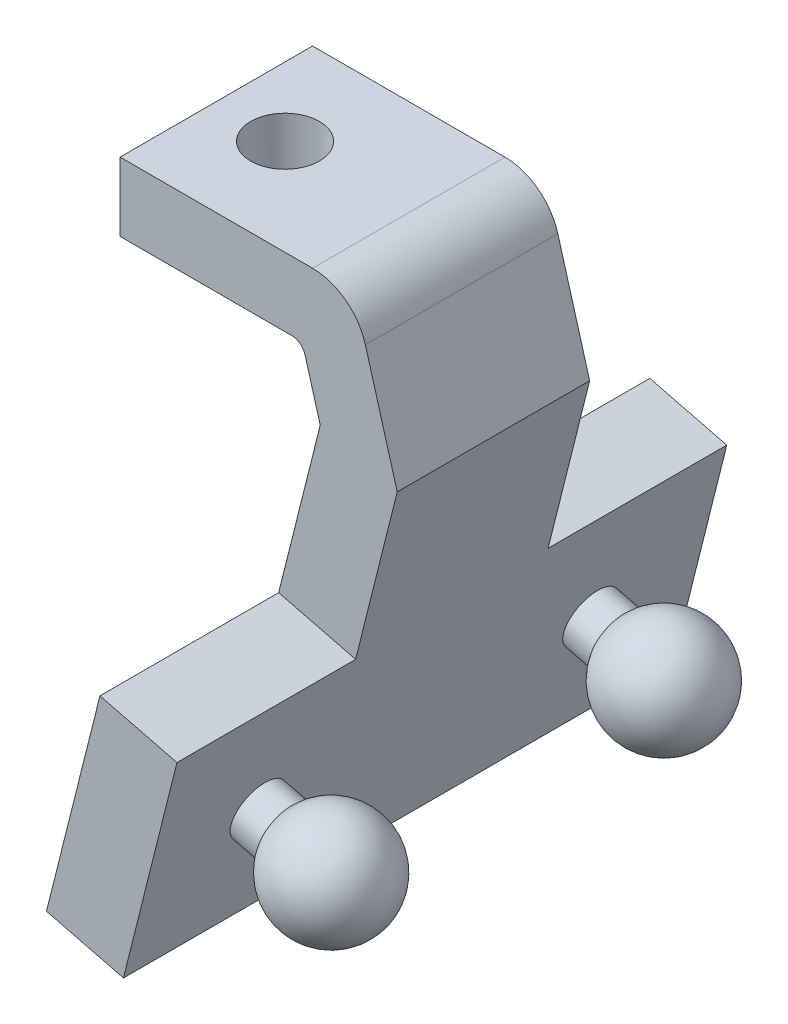
ISO-10303-21;
HEADER;
FILE_DESCRIPTION(('STEP AP214'),'2;1');
FILE_NAME('part.step','',(''),(''),'','','');
FILE_SCHEMA(('AUTOMOTIVE_DESIGN { 1 0 10303 214 1 1 1 1 }'));
ENDSEC;
DATA;
#1=APPLICATION_CONTEXT('core data for automotive mechanical design processes');
#2=APPLICATION_PROTOCOL_DEFINITION('international standard','automotive_design',2000,#1);
#3=PRODUCT_CONTEXT('',#1,'mechanical');
#4=PRODUCT('Part','Part','',(#3));
#5=PRODUCT_RELATED_PRODUCT_CATEGORY('part','',(#4));
#6=PRODUCT_DEFINITION_FORMATION('','',#4);
#7=PRODUCT_DEFINITION_CONTEXT('part definition',#1,'design');
#8=PRODUCT_DEFINITION('design','',#6,#7);
#9=PRODUCT_DEFINITION_SHAPE('','',#8);
#10=(LENGTH_UNIT() NAMED_UNIT(*) SI_UNIT(.MILLI.,.METRE.));
#11=(NAMED_UNIT(*) PLANE_ANGLE_UNIT() SI_UNIT($,.RADIAN.));
#12=(NAMED_UNIT(*) SI_UNIT($,.STERADIAN.) SOLID_ANGLE_UNIT());
#13=UNCERTAINTY_MEASURE_WITH_UNIT(LENGTH_MEASURE(1.E-05),#10,'distance_accuracy_value','');
#14=(GEOMETRIC_REPRESENTATION_CONTEXT(3) GLOBAL_UNCERTAINTY_ASSIGNED_CONTEXT((#13)) GLOBAL_UNIT_ASSIGNED_CONTEXT((#10,
#11,#12)) REPRESENTATION_CONTEXT('',''));
#15=CARTESIAN_POINT('',(0.,0.,0.));
#16=DIRECTION('',(0.,0.,1.));
#17=DIRECTION('',(1.,0.,0.));
#18=AXIS2_PLACEMENT_3D('',#15,#16,#17);
#19=CARTESIAN_POINT('',(0.,0.,3.5));
#20=DIRECTION('',(1.,0.,0.));
#21=DIRECTION('',(0.,0.,-1.));
#22=AXIS2_PLACEMENT_3D('',#19,#20,#21);
#23=PLANE('',#22);
#24=DIRECTION('',(0.,-1.,0.));
#25=VECTOR('',#24,1.);
#26=CARTESIAN_POINT('',(0.,0.,-3.5));
#27=LINE('',#26,#25);
#28=CARTESIAN_POINT('',(0.,2.5,-3.5));
#29=VERTEX_POINT('',#28);
#30=CARTESIAN_POINT('',(0.,0.,-3.5));
#31=VERTEX_POINT('',#30);
#32=EDGE_CURVE('E212',#29,#31,#27,.T.);
#33=ORIENTED_EDGE('',*,*,#32,.T.);
#34=DIRECTION('',(0.,0.,-1.));
#35=VECTOR('',#34,1.);
#36=CARTESIAN_POINT('',(0.,0.,3.5));
#37=LINE('',#36,#35);
#38=CARTESIAN_POINT('',(0.,0.,3.5));
#39=VERTEX_POINT('',#38);
#40=EDGE_CURVE('E252',#39,#31,#37,.T.);
#41=ORIENTED_EDGE('',*,*,#40,.F.);
#42=DIRECTION('',(0.,-1.,0.));
#43=VECTOR('',#42,1.);
#44=CARTESIAN_POINT('',(0.,0.,3.5));
#45=LINE('',#44,#43);
#46=CARTESIAN_POINT('',(0.,2.5,3.5));
#47=VERTEX_POINT('',#46);
#48=EDGE_CURVE('E192',#47,#39,#45,.T.);
#49=ORIENTED_EDGE('',*,*,#48,.F.);
#50=DIRECTION('',(0.,0.,-1.));
#51=VECTOR('',#50,1.);
#52=CARTESIAN_POINT('',(0.,2.5,3.5));
#53=LINE('',#52,#51);
#54=EDGE_CURVE('E211',#47,#29,#53,.T.);
#55=ORIENTED_EDGE('',*,*,#54,.T.);
#56=EDGE_LOOP('',(#33,#41,#49,#55));
#57=FACE_BOUND('',#56,.T.);
#58=ADVANCED_FACE('F41',(#57),#23,.F.);
#59=CARTESIAN_POINT('',(0.,0.,3.5));
#60=DIRECTION('',(0.,1.,0.));
#61=DIRECTION('',(0.,0.,1.));
#62=AXIS2_PLACEMENT_3D('',#59,#60,#61);
#63=PLANE('',#62);
#64=CARTESIAN_POINT('',(2.5,0.,0.));
#65=DIRECTION('',(0.,-1.,0.));
#66=DIRECTION('',(1.,0.,0.));
#67=AXIS2_PLACEMENT_3D('',#64,#65,#66);
#68=CIRCLE('',#67,1.25);
#69=CARTESIAN_POINT('',(3.75,0.,0.));
#70=VERTEX_POINT('',#69);
#71=EDGE_CURVE('E188',#70,#70,#68,.T.);
#72=ORIENTED_EDGE('',*,*,#71,.F.);
#73=EDGE_LOOP('',(#72));
#74=FACE_BOUND('',#73,.T.);
#75=DIRECTION('',(1.,0.,0.));
#76=VECTOR('',#75,1.);
#77=CARTESIAN_POINT('',(0.,0.,-3.5));
#78=LINE('',#77,#76);
#79=CARTESIAN_POINT('',(6.24543275290352,0.,-3.5));
#80=VERTEX_POINT('',#79);
#81=EDGE_CURVE('E215',#31,#80,#78,.T.);
#82=ORIENTED_EDGE('',*,*,#81,.T.);
#83=DIRECTION('',(0.,0.,-1.));
#84=VECTOR('',#83,1.);
#85=CARTESIAN_POINT('',(6.24543275290352,0.,3.5));
#86=LINE('',#85,#84);
#87=CARTESIAN_POINT('',(6.24543275290352,0.,3.5));
#88=VERTEX_POINT('',#87);
#89=EDGE_CURVE('E249',#88,#80,#86,.T.);
#90=ORIENTED_EDGE('',*,*,#89,.F.);
#91=DIRECTION('',(1.,0.,0.));
#92=VECTOR('',#91,1.);
#93=CARTESIAN_POINT('',(0.,0.,3.5));
#94=LINE('',#93,#92);
#95=EDGE_CURVE('E195',#39,#88,#94,.T.);
#96=ORIENTED_EDGE('',*,*,#95,.F.);
#97=ORIENTED_EDGE('',*,*,#40,.T.);
#98=EDGE_LOOP('',(#82,#90,#96,#97));
#99=FACE_BOUND('',#98,.T.);
#100=ADVANCED_FACE('F295',(#74,#99),#63,.F.);
#101=CARTESIAN_POINT('',(6.24543275290367,-0.5,3.5));
#102=DIRECTION('',(0.,0.,-1.));
#103=DIRECTION('',(-1.,0.,0.));
#104=AXIS2_PLACEMENT_3D('',#101,#102,#103);
#105=CYLINDRICAL_SURFACE('',#104,0.499999999999929);
#106=CARTESIAN_POINT('',(6.24543275290367,-0.5,-3.5));
#107=DIRECTION('',(0.,0.,-1.));
#108=DIRECTION('',(-1.,0.,0.));
#109=AXIS2_PLACEMENT_3D('',#106,#107,#108);
#110=CIRCLE('',#109,0.499999999999929);
#111=CARTESIAN_POINT('',(6.72624123981867,-0.362802336352114,-3.5));
#112=VERTEX_POINT('',#111);
#113=EDGE_CURVE('E217',#80,#112,#110,.T.);
#114=ORIENTED_EDGE('',*,*,#113,.T.);
#115=DIRECTION('',(0.,0.,-1.));
#116=VECTOR('',#115,1.);
#117=CARTESIAN_POINT('',(6.72624123981867,-0.362802336352114,3.5));
#118=LINE('',#117,#116);
#119=CARTESIAN_POINT('',(6.72624123981867,-0.362802336352114,3.5));
#120=VERTEX_POINT('',#119);
#121=EDGE_CURVE('E246',#120,#112,#118,.T.);
#122=ORIENTED_EDGE('',*,*,#121,.F.);
#123=CARTESIAN_POINT('',(6.24543275290367,-0.5,3.5));
#124=DIRECTION('',(0.,0.,-1.));
#125=DIRECTION('',(-1.,0.,0.));
#126=AXIS2_PLACEMENT_3D('',#123,#124,#125);
#127=CIRCLE('',#126,0.499999999999929);
#128=EDGE_CURVE('E198',#88,#120,#127,.T.);
#129=ORIENTED_EDGE('',*,*,#128,.F.);
#130=ORIENTED_EDGE('',*,*,#89,.T.);
#131=EDGE_LOOP('',(#114,#122,#129,#130));
#132=FACE_BOUND('',#131,.T.);
#133=ADVANCED_FACE('F291',(#132),#105,.F.);
#134=CARTESIAN_POINT('',(6.7262412398186,-0.362802336352133,3.5));
#135=DIRECTION('',(0.961616973830157,0.274395327295732,0.));
#136=DIRECTION('',(-0.274395327295732,0.961616973830157,0.));
#137=AXIS2_PLACEMENT_3D('',#134,#135,#136);
#138=PLANE('',#137);
#139=DIRECTION('',(0.274395327295732,-0.961616973830156,0.));
#140=VECTOR('',#139,1.);
#141=CARTESIAN_POINT('',(6.7262412398186,-0.362802336352133,-3.5));
#142=LINE('',#141,#140);
#143=CARTESIAN_POINT('',(7.28017081267278,-2.30404559589561,-3.5));
#144=VERTEX_POINT('',#143);
#145=EDGE_CURVE('E219',#112,#144,#142,.T.);
#146=ORIENTED_EDGE('',*,*,#145,.T.);
#147=DIRECTION('',(0.,0.,-1.));
#148=VECTOR('',#147,1.);
#149=CARTESIAN_POINT('',(7.28017081267278,-2.30404559589561,3.5));
#150=LINE('',#149,#148);
#151=CARTESIAN_POINT('',(7.28017081267278,-2.30404559589561,3.5));
#152=VERTEX_POINT('',#151);
#153=EDGE_CURVE('E244',#152,#144,#150,.T.);
#154=ORIENTED_EDGE('',*,*,#153,.F.);
#155=DIRECTION('',(0.274395327295732,-0.961616973830156,0.));
#156=VECTOR('',#155,1.);
#157=CARTESIAN_POINT('',(6.7262412398186,-0.362802336352133,3.5));
#158=LINE('',#157,#156);
#159=EDGE_CURVE('E200',#120,#152,#158,.T.);
#160=ORIENTED_EDGE('',*,*,#159,.F.);
#161=ORIENTED_EDGE('',*,*,#121,.T.);
#162=EDGE_LOOP('',(#146,#154,#160,#161));
#163=FACE_BOUND('',#162,.T.);
#164=ADVANCED_FACE('F286',(#163),#138,.F.);
#165=CARTESIAN_POINT('',(7.28017081267278,-2.30404559589561,3.5));
#166=DIRECTION('',(0.969982391695104,-0.243175162797203,0.));
#167=DIRECTION('',(0.243175162797203,0.969982391695104,0.));
#168=AXIS2_PLACEMENT_3D('',#165,#166,#167);
#169=PLANE('',#168);
#170=DIRECTION('',(-0.243175162797203,-0.969982391695104,0.));
#171=VECTOR('',#170,1.);
#172=CARTESIAN_POINT('',(7.28017081267278,-2.30404559589561,-3.5));
#173=LINE('',#172,#171);
#174=CARTESIAN_POINT('',(5.76806067353204,-8.33558348981006,-3.5));
#175=VERTEX_POINT('',#174);
#176=EDGE_CURVE('E159',#144,#175,#173,.T.);
#177=ORIENTED_EDGE('',*,*,#176,.T.);
#178=DIRECTION('',(0.,0.,1.));
#179=VECTOR('',#178,1.);
#180=CARTESIAN_POINT('',(5.76806067353204,-8.33558348981006,10.));
#181=LINE('',#180,#179);
#182=CARTESIAN_POINT('',(5.76806067353204,-8.33558348981006,-10.));
#183=VERTEX_POINT('',#182);
#184=EDGE_CURVE('E144',#183,#175,#181,.T.);
#185=ORIENTED_EDGE('',*,*,#184,.F.);
#186=DIRECTION('',(0.243175162797199,0.969982391695105,0.));
#187=VECTOR('',#186,1.);
#188=CARTESIAN_POINT('',(5.76806067353204,-8.33558348981006,-10.));
#189=LINE('',#188,#187);
#190=CARTESIAN_POINT('',(3.82265937115445,-16.0954426233709,-10.));
#191=VERTEX_POINT('',#190);
#192=EDGE_CURVE('E156',#191,#183,#189,.T.);
#193=ORIENTED_EDGE('',*,*,#192,.F.);
#194=DIRECTION('',(0.,0.,-1.));
#195=VECTOR('',#194,1.);
#196=CARTESIAN_POINT('',(3.82265937115443,-16.0954426233709,3.5));
#197=LINE('',#196,#195);
#198=CARTESIAN_POINT('',(3.82265937115445,-16.0954426233709,10.));
#199=VERTEX_POINT('',#198);
#200=EDGE_CURVE('E242',#199,#191,#197,.T.);
#201=ORIENTED_EDGE('',*,*,#200,.F.);
#202=DIRECTION('',(-0.243175162797199,-0.969982391695105,0.));
#203=VECTOR('',#202,1.);
#204=CARTESIAN_POINT('',(5.76806067353204,-8.33558348981006,10.));
#205=LINE('',#204,#203);
#206=CARTESIAN_POINT('',(5.76806067353204,-8.33558348981006,10.));
#207=VERTEX_POINT('',#206);
#208=EDGE_CURVE('E150',#207,#199,#205,.T.);
#209=ORIENTED_EDGE('',*,*,#208,.F.);
#210=CARTESIAN_POINT('',(5.76806067353205,-8.33558348981006,3.5));
#211=VERTEX_POINT('',#210);
#212=EDGE_CURVE('E160',#211,#207,#181,.T.);
#213=ORIENTED_EDGE('',*,*,#212,.F.);
#214=DIRECTION('',(-0.243175162797203,-0.969982391695104,0.));
#215=VECTOR('',#214,1.);
#216=CARTESIAN_POINT('',(7.28017081267278,-2.30404559589561,3.5));
#217=LINE('',#216,#215);
#218=EDGE_CURVE('E55',#152,#211,#217,.T.);
#219=ORIENTED_EDGE('',*,*,#218,.F.);
#220=ORIENTED_EDGE('',*,*,#153,.T.);
#221=EDGE_LOOP('',(#177,#185,#193,#201,#209,#213,#219,#220));
#222=FACE_BOUND('',#221,.T.);
#223=ADVANCED_FACE('F155',(#222),#169,.F.);
#224=CARTESIAN_POINT('',(3.82265937115443,-16.0954426233709,3.5));
#225=DIRECTION('',(0.243175162797201,0.969982391695104,0.));
#226=DIRECTION('',(-0.969982391695104,0.243175162797201,0.));
#227=AXIS2_PLACEMENT_3D('',#224,#225,#226);
#228=PLANE('',#227);
#229=ORIENTED_EDGE('',*,*,#200,.T.);
#230=DIRECTION('',(0.969982391695105,-0.243175162797199,0.));
#231=VECTOR('',#230,1.);
#232=CARTESIAN_POINT('',(3.82265937115445,-16.0954426233709,-10.));
#233=LINE('',#232,#231);
#234=CARTESIAN_POINT('',(6.62275734592642,-16.7974288518769,-10.));
#235=VERTEX_POINT('',#234);
#236=EDGE_CURVE('E165',#191,#235,#233,.T.);
#237=ORIENTED_EDGE('',*,*,#236,.T.);
#238=DIRECTION('',(0.,0.,-1.));
#239=VECTOR('',#238,1.);
#240=CARTESIAN_POINT('',(6.6227573459264,-16.7974288518769,3.5));
#241=LINE('',#240,#239);
#242=CARTESIAN_POINT('',(6.62275734592642,-16.7974288518769,10.));
#243=VERTEX_POINT('',#242);
#244=EDGE_CURVE('E240',#243,#235,#241,.T.);
#245=ORIENTED_EDGE('',*,*,#244,.F.);
#246=DIRECTION('',(0.969982391695105,-0.243175162797199,0.));
#247=VECTOR('',#246,1.);
#248=CARTESIAN_POINT('',(3.82265937115445,-16.0954426233709,10.));
#249=LINE('',#248,#247);
#250=EDGE_CURVE('E182',#199,#243,#249,.T.);
#251=ORIENTED_EDGE('',*,*,#250,.F.);
#252=EDGE_LOOP('',(#229,#237,#245,#251));
#253=FACE_BOUND('',#252,.T.);
#254=ADVANCED_FACE('F282',(#253),#228,.F.);
#255=CARTESIAN_POINT('',(6.6227573459264,-16.7974288518769,3.5));
#256=DIRECTION('',(-0.969982391695105,0.2431751627972,0.));
#257=DIRECTION('',(-0.2431751627972,-0.969982391695105,0.));
#258=AXIS2_PLACEMENT_3D('',#255,#256,#257);
#259=PLANE('',#258);
#260=CARTESIAN_POINT('',(7.57848152332634,-12.9852154139102,-6.05019385851449));
#261=DIRECTION('',(-0.969982391695105,0.243175162797199,0.));
#262=DIRECTION('',(0.243175162797199,0.969982391695105,0.));
#263=AXIS2_PLACEMENT_3D('',#260,#261,#262);
#264=CIRCLE('',#263,1.);
#265=CARTESIAN_POINT('',(7.82165668612354,-12.0152330222151,-6.05019385851449));
#266=VERTEX_POINT('',#265);
#267=EDGE_CURVE('E341',#266,#266,#264,.T.);
#268=ORIENTED_EDGE('',*,*,#267,.T.);
#269=EDGE_LOOP('',(#268));
#270=FACE_BOUND('',#269,.T.);
#271=CARTESIAN_POINT('',(7.57848152332632,-12.9852154139102,6.05019385851449));
#272=DIRECTION('',(-0.969982391695105,0.2431751627972,0.));
#273=DIRECTION('',(-0.2431751627972,-0.969982391695105,0.));
#274=AXIS2_PLACEMENT_3D('',#271,#272,#273);
#275=CIRCLE('',#274,1.);
#276=CARTESIAN_POINT('',(7.33530636052912,-13.9551978056053,6.05019385851449));
#277=VERTEX_POINT('',#276);
#278=EDGE_CURVE('E11',#277,#277,#275,.F.);
#279=ORIENTED_EDGE('',*,*,#278,.F.);
#280=EDGE_LOOP('',(#279));
#281=FACE_BOUND('',#280,.T.);
#282=DIRECTION('',(0.2431751627972,0.969982391695105,0.));
#283=VECTOR('',#282,1.);
#284=CARTESIAN_POINT('',(6.6227573459264,-16.7974288518769,3.5));
#285=LINE('',#284,#283);
#286=CARTESIAN_POINT('',(8.568158648304,-9.03756971831606,3.5));
#287=VERTEX_POINT('',#286);
#288=CARTESIAN_POINT('',(10.0802687874447,-3.00603182440153,3.5));
#289=VERTEX_POINT('',#288);
#290=EDGE_CURVE('E203',#287,#289,#285,.T.);
#291=ORIENTED_EDGE('',*,*,#290,.F.);
#292=DIRECTION('',(0.,0.,1.));
#293=VECTOR('',#292,1.);
#294=CARTESIAN_POINT('',(8.568158648304,-9.03756971831606,10.));
#295=LINE('',#294,#293);
#296=CARTESIAN_POINT('',(8.568158648304,-9.03756971831606,10.));
#297=VERTEX_POINT('',#296);
#298=EDGE_CURVE('E178',#287,#297,#295,.T.);
#299=ORIENTED_EDGE('',*,*,#298,.T.);
#300=DIRECTION('',(-0.243175162797199,-0.969982391695105,0.));
#301=VECTOR('',#300,1.);
#302=CARTESIAN_POINT('',(8.568158648304,-9.03756971831606,10.));
#303=LINE('',#302,#301);
#304=EDGE_CURVE('E166',#297,#243,#303,.T.);
#305=ORIENTED_EDGE('',*,*,#304,.T.);
#306=ORIENTED_EDGE('',*,*,#244,.T.);
#307=DIRECTION('',(0.243175162797199,0.969982391695105,0.));
#308=VECTOR('',#307,1.);
#309=CARTESIAN_POINT('',(8.568158648304,-9.03756971831606,-10.));
#310=LINE('',#309,#308);
#311=CARTESIAN_POINT('',(8.568158648304,-9.03756971831606,-10.));
#312=VERTEX_POINT('',#311);
#313=EDGE_CURVE('E176',#235,#312,#310,.T.);
#314=ORIENTED_EDGE('',*,*,#313,.T.);
#315=CARTESIAN_POINT('',(8.56815864830399,-9.03756971831606,-3.5));
#316=VERTEX_POINT('',#315);
#317=EDGE_CURVE('E63',#312,#316,#295,.T.);
#318=ORIENTED_EDGE('',*,*,#317,.T.);
#319=DIRECTION('',(0.2431751627972,0.969982391695105,0.));
#320=VECTOR('',#319,1.);
#321=CARTESIAN_POINT('',(6.6227573459264,-16.7974288518769,-3.5));
#322=LINE('',#321,#320);
#323=CARTESIAN_POINT('',(10.0802687874447,-3.00603182440153,-3.5));
#324=VERTEX_POINT('',#323);
#325=EDGE_CURVE('E222',#316,#324,#322,.T.);
#326=ORIENTED_EDGE('',*,*,#325,.T.);
#327=DIRECTION('',(0.,0.,-1.));
#328=VECTOR('',#327,1.);
#329=CARTESIAN_POINT('',(10.0802687874447,-3.00603182440153,3.5));
#330=LINE('',#329,#328);
#331=EDGE_CURVE('E237',#289,#324,#330,.T.);
#332=ORIENTED_EDGE('',*,*,#331,.F.);
#333=EDGE_LOOP('',(#291,#299,#305,#306,#314,#318,#326,#332));
#334=FACE_BOUND('',#333,.T.);
#335=ADVANCED_FACE('F263',(#270,#281,#334),#259,.F.);
#336=CARTESIAN_POINT('',(10.0802687874447,-3.00603182440153,3.5));
#337=DIRECTION('',(-0.961616973830156,-0.274395327295733,0.));
#338=DIRECTION('',(0.274395327295733,-0.961616973830156,0.));
#339=AXIS2_PLACEMENT_3D('',#336,#337,#338);
#340=PLANE('',#339);
#341=DIRECTION('',(-0.274395327295733,0.961616973830157,0.));
#342=VECTOR('',#341,1.);
#343=CARTESIAN_POINT('',(10.0802687874447,-3.00603182440153,-3.5));
#344=LINE('',#343,#342);
#345=CARTESIAN_POINT('',(8.92323394766049,1.04879065459145,-3.5));
#346=VERTEX_POINT('',#345);
#347=EDGE_CURVE('E224',#324,#346,#344,.T.);
#348=ORIENTED_EDGE('',*,*,#347,.T.);
#349=DIRECTION('',(0.,0.,-1.));
#350=VECTOR('',#349,1.);
#351=CARTESIAN_POINT('',(8.92323394766049,1.04879065459145,3.5));
#352=LINE('',#351,#350);
#353=CARTESIAN_POINT('',(8.92323394766049,1.04879065459145,3.5));
#354=VERTEX_POINT('',#353);
#355=EDGE_CURVE('E234',#354,#346,#352,.T.);
#356=ORIENTED_EDGE('',*,*,#355,.F.);
#357=DIRECTION('',(-0.274395327295733,0.961616973830157,0.));
#358=VECTOR('',#357,1.);
#359=CARTESIAN_POINT('',(10.0802687874447,-3.00603182440153,3.5));
#360=LINE('',#359,#358);
#361=EDGE_CURVE('E205',#289,#354,#360,.T.);
#362=ORIENTED_EDGE('',*,*,#361,.F.);
#363=ORIENTED_EDGE('',*,*,#331,.T.);
#364=EDGE_LOOP('',(#348,#356,#362,#363));
#365=FACE_BOUND('',#364,.T.);
#366=ADVANCED_FACE('F266',(#365),#340,.F.);
#367=CARTESIAN_POINT('',(7.,0.5,3.5));
#368=DIRECTION('',(0.,0.,-1.));
#369=DIRECTION('',(-1.,0.,0.));
#370=AXIS2_PLACEMENT_3D('',#367,#368,#369);
#371=CYLINDRICAL_SURFACE('',#370,2.00000000000008);
#372=CARTESIAN_POINT('',(7.,0.5,-3.5));
#373=DIRECTION('',(0.,0.,1.));
#374=DIRECTION('',(1.,0.,0.));
#375=AXIS2_PLACEMENT_3D('',#372,#373,#374);
#376=CIRCLE('',#375,2.00000000000008);
#377=CARTESIAN_POINT('',(7.,2.50000000000008,-3.5));
#378=VERTEX_POINT('',#377);
#379=EDGE_CURVE('E226',#346,#378,#376,.T.);
#380=ORIENTED_EDGE('',*,*,#379,.T.);
#381=DIRECTION('',(0.,0.,-1.));
#382=VECTOR('',#381,1.);
#383=CARTESIAN_POINT('',(7.,2.50000000000008,3.5));
#384=LINE('',#383,#382);
#385=CARTESIAN_POINT('',(7.,2.50000000000008,3.5));
#386=VERTEX_POINT('',#385);
#387=EDGE_CURVE('E231',#386,#378,#384,.T.);
#388=ORIENTED_EDGE('',*,*,#387,.F.);
#389=CARTESIAN_POINT('',(7.,0.5,3.5));
#390=DIRECTION('',(0.,0.,1.));
#391=DIRECTION('',(1.,0.,0.));
#392=AXIS2_PLACEMENT_3D('',#389,#390,#391);
#393=CIRCLE('',#392,2.00000000000008);
#394=EDGE_CURVE('E207',#354,#386,#393,.T.);
#395=ORIENTED_EDGE('',*,*,#394,.F.);
#396=ORIENTED_EDGE('',*,*,#355,.T.);
#397=EDGE_LOOP('',(#380,#388,#395,#396));
#398=FACE_BOUND('',#397,.T.);
#399=ADVANCED_FACE('F305',(#398),#371,.T.);
#400=CARTESIAN_POINT('',(0.,2.5,3.5));
#401=DIRECTION('',(0.,-1.,0.));
#402=DIRECTION('',(0.,0.,-1.));
#403=AXIS2_PLACEMENT_3D('',#400,#401,#402);
#404=PLANE('',#403);
#405=CARTESIAN_POINT('',(2.5,2.5,0.));
#406=DIRECTION('',(0.,-1.,0.));
#407=DIRECTION('',(0.,0.,-1.));
#408=AXIS2_PLACEMENT_3D('',#405,#406,#407);
#409=CIRCLE('',#408,1.25);
#410=CARTESIAN_POINT('',(2.5,2.5,-1.25));
#411=VERTEX_POINT('',#410);
#412=EDGE_CURVE('E191',#411,#411,#409,.T.);
#413=ORIENTED_EDGE('',*,*,#412,.T.);
#414=EDGE_LOOP('',(#413));
#415=FACE_BOUND('',#414,.T.);
#416=DIRECTION('',(-1.,0.,0.));
#417=VECTOR('',#416,1.);
#418=CARTESIAN_POINT('',(0.,2.5,-3.5));
#419=LINE('',#418,#417);
#420=EDGE_CURVE('E196',#378,#29,#419,.T.);
#421=ORIENTED_EDGE('',*,*,#420,.T.);
#422=ORIENTED_EDGE('',*,*,#54,.F.);
#423=DIRECTION('',(-1.,0.,0.));
#424=VECTOR('',#423,1.);
#425=CARTESIAN_POINT('',(0.,2.5,3.5));
#426=LINE('',#425,#424);
#427=EDGE_CURVE('E209',#386,#47,#426,.T.);
#428=ORIENTED_EDGE('',*,*,#427,.F.);
#429=ORIENTED_EDGE('',*,*,#387,.T.);
#430=EDGE_LOOP('',(#421,#422,#428,#429));
#431=FACE_BOUND('',#430,.T.);
#432=ADVANCED_FACE('F302',(#415,#431),#404,.F.);
#433=CARTESIAN_POINT('',(7.,0.5,3.5));
#434=DIRECTION('',(0.,0.,1.));
#435=DIRECTION('',(1.,0.,0.));
#436=AXIS2_PLACEMENT_3D('',#433,#434,#435);
#437=PLANE('',#436);
#438=DIRECTION('',(-0.969982391695105,0.243175162797199,0.));
#439=VECTOR('',#438,1.);
#440=CARTESIAN_POINT('',(4.84305151617268,-8.10368314362267,3.5));
#441=LINE('',#440,#439);
#442=EDGE_CURVE('E181',#287,#211,#441,.T.);
#443=ORIENTED_EDGE('',*,*,#442,.F.);
#444=ORIENTED_EDGE('',*,*,#290,.T.);
#445=ORIENTED_EDGE('',*,*,#361,.T.);
#446=ORIENTED_EDGE('',*,*,#394,.T.);
#447=ORIENTED_EDGE('',*,*,#427,.T.);
#448=ORIENTED_EDGE('',*,*,#48,.T.);
#449=ORIENTED_EDGE('',*,*,#95,.T.);
#450=ORIENTED_EDGE('',*,*,#128,.T.);
#451=ORIENTED_EDGE('',*,*,#159,.T.);
#452=ORIENTED_EDGE('',*,*,#218,.T.);
#453=EDGE_LOOP('',(#443,#444,#445,#446,#447,#448,#449,#450,#451,#452));
#454=FACE_BOUND('',#453,.T.);
#455=ADVANCED_FACE('F269',(#454),#437,.T.);
#456=CARTESIAN_POINT('',(7.,0.5,-3.5));
#457=DIRECTION('',(0.,0.,1.));
#458=DIRECTION('',(1.,0.,0.));
#459=AXIS2_PLACEMENT_3D('',#456,#457,#458);
#460=PLANE('',#459);
#461=ORIENTED_EDGE('',*,*,#325,.F.);
#462=DIRECTION('',(-0.969982391695105,0.243175162797199,0.));
#463=VECTOR('',#462,1.);
#464=CARTESIAN_POINT('',(4.84305151617268,-8.10368314362267,-3.5));
#465=LINE('',#464,#463);
#466=EDGE_CURVE('E48',#316,#175,#465,.T.);
#467=ORIENTED_EDGE('',*,*,#466,.T.);
#468=ORIENTED_EDGE('',*,*,#176,.F.);
#469=ORIENTED_EDGE('',*,*,#145,.F.);
#470=ORIENTED_EDGE('',*,*,#113,.F.);
#471=ORIENTED_EDGE('',*,*,#81,.F.);
#472=ORIENTED_EDGE('',*,*,#32,.F.);
#473=ORIENTED_EDGE('',*,*,#420,.F.);
#474=ORIENTED_EDGE('',*,*,#379,.F.);
#475=ORIENTED_EDGE('',*,*,#347,.F.);
#476=EDGE_LOOP('',(#461,#467,#468,#469,#470,#471,#472,#473,#474,#475));
#477=FACE_BOUND('',#476,.T.);
#478=ADVANCED_FACE('F258',(#477),#460,.F.);
#479=CARTESIAN_POINT('',(2.5,5.5,0.));
#480=DIRECTION('',(0.,-1.,0.));
#481=DIRECTION('',(1.,0.,0.));
#482=AXIS2_PLACEMENT_3D('',#479,#480,#481);
#483=CYLINDRICAL_SURFACE('',#482,1.25);
#484=ORIENTED_EDGE('',*,*,#71,.T.);
#485=EDGE_LOOP('',(#484));
#486=FACE_BOUND('',#485,.T.);
#487=ORIENTED_EDGE('',*,*,#412,.F.);
#488=EDGE_LOOP('',(#487));
#489=FACE_BOUND('',#488,.T.);
#490=ADVANCED_FACE('F363',(#486,#489),#483,.F.);
#491=CARTESIAN_POINT('',(5.76806067353204,-8.33558348981006,-10.));
#492=DIRECTION('',(0.,0.,-1.));
#493=DIRECTION('',(-1.,0.,0.));
#494=AXIS2_PLACEMENT_3D('',#491,#492,#493);
#495=PLANE('',#494);
#496=ORIENTED_EDGE('',*,*,#313,.F.);
#497=ORIENTED_EDGE('',*,*,#236,.F.);
#498=ORIENTED_EDGE('',*,*,#192,.T.);
#499=DIRECTION('',(0.969982391695105,-0.243175162797199,0.));
#500=VECTOR('',#499,1.);
#501=CARTESIAN_POINT('',(5.76806067353204,-8.33558348981006,-10.));
#502=LINE('',#501,#500);
#503=EDGE_CURVE('E141',#183,#312,#502,.T.);
#504=ORIENTED_EDGE('',*,*,#503,.T.);
#505=EDGE_LOOP('',(#496,#497,#498,#504));
#506=FACE_BOUND('',#505,.T.);
#507=ADVANCED_FACE('F163',(#506),#495,.T.);
#508=CARTESIAN_POINT('',(5.76806067353204,-8.33558348981006,10.));
#509=DIRECTION('',(0.243175162797199,0.969982391695105,0.));
#510=DIRECTION('',(-0.969982391695105,0.243175162797199,0.));
#511=AXIS2_PLACEMENT_3D('',#508,#509,#510);
#512=PLANE('',#511);
#513=ORIENTED_EDGE('',*,*,#466,.F.);
#514=ORIENTED_EDGE('',*,*,#317,.F.);
#515=ORIENTED_EDGE('',*,*,#503,.F.);
#516=ORIENTED_EDGE('',*,*,#184,.T.);
#517=EDGE_LOOP('',(#513,#514,#515,#516));
#518=FACE_BOUND('',#517,.T.);
#519=ADVANCED_FACE('F143',(#518),#512,.T.);
#520=CARTESIAN_POINT('',(5.76806067353204,-8.33558348981006,10.));
#521=DIRECTION('',(0.,0.,1.));
#522=DIRECTION('',(0.,-1.,0.));
#523=AXIS2_PLACEMENT_3D('',#520,#521,#522);
#524=PLANE('',#523);
#525=ORIENTED_EDGE('',*,*,#304,.F.);
#526=DIRECTION('',(0.969982391695105,-0.243175162797199,0.));
#527=VECTOR('',#526,1.);
#528=CARTESIAN_POINT('',(5.76806067353204,-8.33558348981006,10.));
#529=LINE('',#528,#527);
#530=EDGE_CURVE('E149',#207,#297,#529,.T.);
#531=ORIENTED_EDGE('',*,*,#530,.F.);
#532=ORIENTED_EDGE('',*,*,#208,.T.);
#533=ORIENTED_EDGE('',*,*,#250,.T.);
#534=EDGE_LOOP('',(#525,#531,#532,#533));
#535=FACE_BOUND('',#534,.T.);
#536=ADVANCED_FACE('F279',(#535),#524,.T.);
#537=ORIENTED_EDGE('',*,*,#298,.F.);
#538=ORIENTED_EDGE('',*,*,#442,.T.);
#539=ORIENTED_EDGE('',*,*,#212,.T.);
#540=ORIENTED_EDGE('',*,*,#530,.T.);
#541=EDGE_LOOP('',(#537,#538,#539,#540));
#542=FACE_BOUND('',#541,.T.);
#543=ADVANCED_FACE('F275',(#542),#512,.T.);
#544=CARTESIAN_POINT('',(8.54846391502144,-13.2283905767074,6.05019385851449));
#545=DIRECTION('',(-0.969982391695105,0.243175162797199,0.));
#546=DIRECTION('',(-0.243175162797199,-0.969982391695105,0.));
#547=AXIS2_PLACEMENT_3D('',#544,#545,#546);
#548=CYLINDRICAL_SURFACE('',#547,1.);
#549=CARTESIAN_POINT('',(8.54846391502144,-13.2283905767074,6.05019385851449));
#550=DIRECTION('',(0.969982391695105,-0.243175162797199,0.));
#551=DIRECTION('',(0.243175162797199,0.969982391695105,0.));
#552=AXIS2_PLACEMENT_3D('',#549,#550,#551);
#553=CIRCLE('',#552,1.);
#554=CARTESIAN_POINT('',(8.79163907781864,-12.2584081850123,6.05019385851449));
#555=VERTEX_POINT('',#554);
#556=EDGE_CURVE('E171',#555,#555,#553,.T.);
#557=ORIENTED_EDGE('',*,*,#556,.F.);
#558=EDGE_LOOP('',(#557));
#559=FACE_BOUND('',#558,.T.);
#560=ORIENTED_EDGE('',*,*,#278,.T.);
#561=EDGE_LOOP('',(#560));
#562=FACE_BOUND('',#561,.T.);
#563=ADVANCED_FACE('F344',(#559,#562),#548,.T.);
#564=CARTESIAN_POINT('',(10.2285226998845,-13.649582313811,6.05019385851449));
#565=DIRECTION('',(-0.969982391695105,0.243175162797199,0.));
#566=DIRECTION('',(0.,0.,1.));
#567=AXIS2_PLACEMENT_3D('',#564,#565,#566);
#568=SPHERICAL_SURFACE('',#567,2.);
#569=ORIENTED_EDGE('',*,*,#556,.T.);
#570=EDGE_LOOP('',(#569));
#571=FACE_BOUND('',#570,.T.);
#572=ADVANCED_FACE('F346',(#571),#568,.T.);
#573=CARTESIAN_POINT('',(8.54846391502144,-13.2283905767074,-6.05019385851449));
#574=DIRECTION('',(-0.969982391695105,0.243175162797199,0.));
#575=DIRECTION('',(-0.243175162797199,-0.969982391695105,0.));
#576=AXIS2_PLACEMENT_3D('',#573,#574,#575);
#577=CYLINDRICAL_SURFACE('',#576,1.);
#578=CARTESIAN_POINT('',(8.54846391502145,-13.2283905767074,-6.05019385851449));
#579=DIRECTION('',(0.969982391695105,-0.243175162797199,0.));
#580=DIRECTION('',(-0.243175162797199,-0.969982391695105,0.));
#581=AXIS2_PLACEMENT_3D('',#578,#579,#580);
#582=CIRCLE('',#581,0.999999999999999);
#583=CARTESIAN_POINT('',(8.30528875222425,-14.1983729684025,-6.05019385851449));
#584=VERTEX_POINT('',#583);
#585=EDGE_CURVE('E429',#584,#584,#582,.T.);
#586=ORIENTED_EDGE('',*,*,#585,.F.);
#587=EDGE_LOOP('',(#586));
#588=FACE_BOUND('',#587,.T.);
#589=ORIENTED_EDGE('',*,*,#267,.F.);
#590=EDGE_LOOP('',(#589));
#591=FACE_BOUND('',#590,.T.);
#592=ADVANCED_FACE('F352',(#588,#591),#577,.T.);
#593=CARTESIAN_POINT('',(10.2285226998845,-13.649582313811,-6.05019385851449));
#594=DIRECTION('',(-0.969982391695105,0.243175162797199,0.));
#595=DIRECTION('',(0.,0.,-1.));
#596=AXIS2_PLACEMENT_3D('',#593,#594,#595);
#597=SPHERICAL_SURFACE('',#596,2.);
#598=ORIENTED_EDGE('',*,*,#585,.T.);
#599=EDGE_LOOP('',(#598));
#600=FACE_BOUND('',#599,.T.);
#601=ADVANCED_FACE('F415',(#600),#597,.T.);
#602=CLOSED_SHELL('',(#58,#100,#133,#164,#223,#254,#335,#366,#399,#432,#455,#478,#490,#507,#519,
#536,#543,#563,#572,#592,#601));
#603=MANIFOLD_SOLID_BREP('B2',#602);
#604=ADVANCED_BREP_SHAPE_REPRESENTATION('',(#18,#603),#14);
#605=SHAPE_DEFINITION_REPRESENTATION(#9,#604);
ENDSEC;
END-ISO-10303-21;
